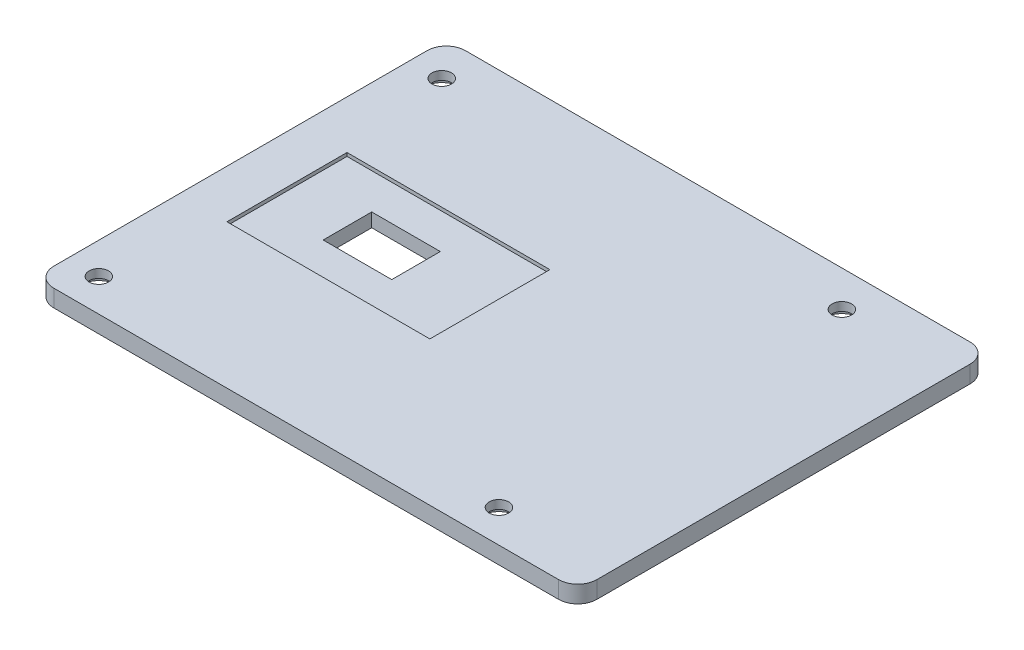
ISO-10303-21;
HEADER;
FILE_DESCRIPTION(('STEP AP214'),'2;1');
FILE_NAME('part.step','',(''),(''),'','','');
FILE_SCHEMA(('AUTOMOTIVE_DESIGN { 1 0 10303 214 1 1 1 1 }'));
ENDSEC;
DATA;
#1=APPLICATION_CONTEXT('core data for automotive mechanical design processes');
#2=APPLICATION_PROTOCOL_DEFINITION('international standard','automotive_design',2000,#1);
#3=PRODUCT_CONTEXT('',#1,'mechanical');
#4=PRODUCT('Part','Part','',(#3));
#5=PRODUCT_RELATED_PRODUCT_CATEGORY('part','',(#4));
#6=PRODUCT_DEFINITION_FORMATION('','',#4);
#7=PRODUCT_DEFINITION_CONTEXT('part definition',#1,'design');
#8=PRODUCT_DEFINITION('design','',#6,#7);
#9=PRODUCT_DEFINITION_SHAPE('','',#8);
#10=(LENGTH_UNIT() NAMED_UNIT(*) SI_UNIT(.MILLI.,.METRE.));
#11=(NAMED_UNIT(*) PLANE_ANGLE_UNIT() SI_UNIT($,.RADIAN.));
#12=(NAMED_UNIT(*) SI_UNIT($,.STERADIAN.) SOLID_ANGLE_UNIT());
#13=UNCERTAINTY_MEASURE_WITH_UNIT(LENGTH_MEASURE(1.E-05),#10,'distance_accuracy_value','');
#14=(GEOMETRIC_REPRESENTATION_CONTEXT(3) GLOBAL_UNCERTAINTY_ASSIGNED_CONTEXT((#13)) GLOBAL_UNIT_ASSIGNED_CONTEXT((#10,
#11,#12)) REPRESENTATION_CONTEXT('',''));
#15=CARTESIAN_POINT('',(0.,0.,0.));
#16=DIRECTION('',(0.,0.,1.));
#17=DIRECTION('',(1.,0.,0.));
#18=AXIS2_PLACEMENT_3D('',#15,#16,#17);
#19=CARTESIAN_POINT('',(-19.5,1.5,36.29));
#20=DIRECTION('',(0.,-1.,0.));
#21=DIRECTION('',(0.,0.,-1.));
#22=AXIS2_PLACEMENT_3D('',#19,#20,#21);
#23=CYLINDRICAL_SURFACE('',#22,3.1);
#24=CARTESIAN_POINT('',(-19.5,1.5,36.29));
#25=DIRECTION('',(0.,-1.,0.));
#26=DIRECTION('',(0.,0.,-1.));
#27=AXIS2_PLACEMENT_3D('',#24,#25,#26);
#28=CIRCLE('',#27,3.1);
#29=CARTESIAN_POINT('',(-19.5,1.5,33.19));
#30=VERTEX_POINT('',#29);
#31=EDGE_CURVE('E185',#30,#30,#28,.T.);
#32=ORIENTED_EDGE('',*,*,#31,.F.);
#33=EDGE_LOOP('',(#32));
#34=FACE_BOUND('',#33,.T.);
#35=CARTESIAN_POINT('',(-19.5,0.5,36.29));
#36=DIRECTION('',(0.,-1.,0.));
#37=DIRECTION('',(0.,0.,-1.));
#38=AXIS2_PLACEMENT_3D('',#35,#36,#37);
#39=CIRCLE('',#38,3.1);
#40=CARTESIAN_POINT('',(-19.5,0.5,33.19));
#41=VERTEX_POINT('',#40);
#42=EDGE_CURVE('E44',#41,#41,#39,.F.);
#43=ORIENTED_EDGE('',*,*,#42,.F.);
#44=EDGE_LOOP('',(#43));
#45=FACE_BOUND('',#44,.T.);
#46=ADVANCED_FACE('F41',(#34,#45),#23,.F.);
#47=CARTESIAN_POINT('',(50.5,1.5,-23.71));
#48=DIRECTION('',(0.,-1.,0.));
#49=DIRECTION('',(0.,0.,-1.));
#50=AXIS2_PLACEMENT_3D('',#47,#48,#49);
#51=CYLINDRICAL_SURFACE('',#50,3.1);
#52=CARTESIAN_POINT('',(50.5,1.5,-23.71));
#53=DIRECTION('',(0.,-1.,0.));
#54=DIRECTION('',(0.,0.,-1.));
#55=AXIS2_PLACEMENT_3D('',#52,#53,#54);
#56=CIRCLE('',#55,3.1);
#57=CARTESIAN_POINT('',(50.5,1.5,-26.81));
#58=VERTEX_POINT('',#57);
#59=EDGE_CURVE('E320',#58,#58,#56,.T.);
#60=ORIENTED_EDGE('',*,*,#59,.F.);
#61=EDGE_LOOP('',(#60));
#62=FACE_BOUND('',#61,.T.);
#63=CARTESIAN_POINT('',(50.5,0.5,-23.71));
#64=DIRECTION('',(0.,-1.,0.));
#65=DIRECTION('',(0.,0.,-1.));
#66=AXIS2_PLACEMENT_3D('',#63,#64,#65);
#67=CIRCLE('',#66,3.1);
#68=CARTESIAN_POINT('',(50.5,0.5,-26.81));
#69=VERTEX_POINT('',#68);
#70=EDGE_CURVE('E315',#69,#69,#67,.F.);
#71=ORIENTED_EDGE('',*,*,#70,.F.);
#72=EDGE_LOOP('',(#71));
#73=FACE_BOUND('',#72,.T.);
#74=ADVANCED_FACE('F341',(#62,#73),#51,.F.);
#75=CARTESIAN_POINT('',(50.5,1.5,36.29));
#76=DIRECTION('',(0.,-1.,0.));
#77=DIRECTION('',(0.,0.,-1.));
#78=AXIS2_PLACEMENT_3D('',#75,#76,#77);
#79=CYLINDRICAL_SURFACE('',#78,3.1);
#80=CARTESIAN_POINT('',(50.5,1.5,36.29));
#81=DIRECTION('',(0.,-1.,0.));
#82=DIRECTION('',(0.,0.,-1.));
#83=AXIS2_PLACEMENT_3D('',#80,#81,#82);
#84=CIRCLE('',#83,3.1);
#85=CARTESIAN_POINT('',(50.5,1.5,33.19));
#86=VERTEX_POINT('',#85);
#87=EDGE_CURVE('E324',#86,#86,#84,.T.);
#88=ORIENTED_EDGE('',*,*,#87,.F.);
#89=EDGE_LOOP('',(#88));
#90=FACE_BOUND('',#89,.T.);
#91=CARTESIAN_POINT('',(50.5,0.5,36.29));
#92=DIRECTION('',(0.,-1.,0.));
#93=DIRECTION('',(0.,0.,-1.));
#94=AXIS2_PLACEMENT_3D('',#91,#92,#93);
#95=CIRCLE('',#94,3.1);
#96=CARTESIAN_POINT('',(50.5,0.5,33.19));
#97=VERTEX_POINT('',#96);
#98=EDGE_CURVE('E307',#97,#97,#95,.F.);
#99=ORIENTED_EDGE('',*,*,#98,.F.);
#100=EDGE_LOOP('',(#99));
#101=FACE_BOUND('',#100,.T.);
#102=ADVANCED_FACE('F346',(#90,#101),#79,.F.);
#103=CARTESIAN_POINT('',(-19.5,1.5,-23.71));
#104=DIRECTION('',(0.,-1.,0.));
#105=DIRECTION('',(0.,0.,-1.));
#106=AXIS2_PLACEMENT_3D('',#103,#104,#105);
#107=CYLINDRICAL_SURFACE('',#106,3.1);
#108=CARTESIAN_POINT('',(-19.5,1.5,-23.71));
#109=DIRECTION('',(0.,-1.,0.));
#110=DIRECTION('',(0.,0.,-1.));
#111=AXIS2_PLACEMENT_3D('',#108,#109,#110);
#112=CIRCLE('',#111,3.1);
#113=CARTESIAN_POINT('',(-19.5,1.5,-26.81));
#114=VERTEX_POINT('',#113);
#115=EDGE_CURVE('E328',#114,#114,#112,.T.);
#116=ORIENTED_EDGE('',*,*,#115,.F.);
#117=EDGE_LOOP('',(#116));
#118=FACE_BOUND('',#117,.T.);
#119=CARTESIAN_POINT('',(-19.5,0.5,-23.71));
#120=DIRECTION('',(0.,-1.,0.));
#121=DIRECTION('',(0.,0.,-1.));
#122=AXIS2_PLACEMENT_3D('',#119,#120,#121);
#123=CIRCLE('',#122,3.1);
#124=CARTESIAN_POINT('',(-19.5,0.5,-26.81));
#125=VERTEX_POINT('',#124);
#126=EDGE_CURVE('E306',#125,#125,#123,.F.);
#127=ORIENTED_EDGE('',*,*,#126,.F.);
#128=EDGE_LOOP('',(#127));
#129=FACE_BOUND('',#128,.T.);
#130=ADVANCED_FACE('F398',(#118,#129),#107,.F.);
#131=CARTESIAN_POINT('',(-19.5,0.,-23.71));
#132=DIRECTION('',(0.,1.,0.));
#133=DIRECTION('',(0.,0.,1.));
#134=AXIS2_PLACEMENT_3D('',#131,#132,#133);
#135=CYLINDRICAL_SURFACE('',#134,1.7);
#136=CARTESIAN_POINT('',(-19.5,3.,-23.71));
#137=DIRECTION('',(0.,1.,0.));
#138=DIRECTION('',(0.,0.,1.));
#139=AXIS2_PLACEMENT_3D('',#136,#137,#138);
#140=CIRCLE('',#139,1.7);
#141=CARTESIAN_POINT('',(-19.5,3.,-22.01));
#142=VERTEX_POINT('',#141);
#143=EDGE_CURVE('E236',#142,#142,#140,.T.);
#144=ORIENTED_EDGE('',*,*,#143,.T.);
#145=EDGE_LOOP('',(#144));
#146=FACE_BOUND('',#145,.T.);
#147=CARTESIAN_POINT('',(-19.5,1.5,-23.71));
#148=DIRECTION('',(0.,-1.,0.));
#149=DIRECTION('',(0.,0.,-1.));
#150=AXIS2_PLACEMENT_3D('',#147,#148,#149);
#151=CIRCLE('',#150,1.7);
#152=CARTESIAN_POINT('',(-19.5,1.5,-25.41));
#153=VERTEX_POINT('',#152);
#154=EDGE_CURVE('E186',#153,#153,#151,.F.);
#155=ORIENTED_EDGE('',*,*,#154,.F.);
#156=EDGE_LOOP('',(#155));
#157=FACE_BOUND('',#156,.T.);
#158=ADVANCED_FACE('F387',(#146,#157),#135,.F.);
#159=CARTESIAN_POINT('',(50.5,0.,36.29));
#160=DIRECTION('',(0.,1.,0.));
#161=DIRECTION('',(0.,0.,1.));
#162=AXIS2_PLACEMENT_3D('',#159,#160,#161);
#163=CYLINDRICAL_SURFACE('',#162,1.7);
#164=CARTESIAN_POINT('',(50.5,3.,36.29));
#165=DIRECTION('',(0.,1.,0.));
#166=DIRECTION('',(0.,0.,1.));
#167=AXIS2_PLACEMENT_3D('',#164,#165,#166);
#168=CIRCLE('',#167,1.7);
#169=CARTESIAN_POINT('',(50.5,3.,37.99));
#170=VERTEX_POINT('',#169);
#171=EDGE_CURVE('E224',#170,#170,#168,.T.);
#172=ORIENTED_EDGE('',*,*,#171,.T.);
#173=EDGE_LOOP('',(#172));
#174=FACE_BOUND('',#173,.T.);
#175=CARTESIAN_POINT('',(50.5,1.5,36.29));
#176=DIRECTION('',(0.,-1.,0.));
#177=DIRECTION('',(0.,0.,-1.));
#178=AXIS2_PLACEMENT_3D('',#175,#176,#177);
#179=CIRCLE('',#178,1.7);
#180=CARTESIAN_POINT('',(50.5,1.5,34.59));
#181=VERTEX_POINT('',#180);
#182=EDGE_CURVE('E301',#181,#181,#179,.F.);
#183=ORIENTED_EDGE('',*,*,#182,.F.);
#184=EDGE_LOOP('',(#183));
#185=FACE_BOUND('',#184,.T.);
#186=ADVANCED_FACE('F389',(#174,#185),#163,.F.);
#187=CARTESIAN_POINT('',(50.5,0.,-23.71));
#188=DIRECTION('',(0.,1.,0.));
#189=DIRECTION('',(0.,0.,1.));
#190=AXIS2_PLACEMENT_3D('',#187,#188,#189);
#191=CYLINDRICAL_SURFACE('',#190,1.7);
#192=CARTESIAN_POINT('',(50.5,3.,-23.71));
#193=DIRECTION('',(0.,1.,0.));
#194=DIRECTION('',(0.,0.,1.));
#195=AXIS2_PLACEMENT_3D('',#192,#193,#194);
#196=CIRCLE('',#195,1.7);
#197=CARTESIAN_POINT('',(50.5,3.,-22.01));
#198=VERTEX_POINT('',#197);
#199=EDGE_CURVE('E235',#198,#198,#196,.T.);
#200=ORIENTED_EDGE('',*,*,#199,.T.);
#201=EDGE_LOOP('',(#200));
#202=FACE_BOUND('',#201,.T.);
#203=CARTESIAN_POINT('',(50.5,1.5,-23.71));
#204=DIRECTION('',(0.,-1.,0.));
#205=DIRECTION('',(0.,0.,-1.));
#206=AXIS2_PLACEMENT_3D('',#203,#204,#205);
#207=CIRCLE('',#206,1.7);
#208=CARTESIAN_POINT('',(50.5,1.5,-25.41));
#209=VERTEX_POINT('',#208);
#210=EDGE_CURVE('E296',#209,#209,#207,.F.);
#211=ORIENTED_EDGE('',*,*,#210,.F.);
#212=EDGE_LOOP('',(#211));
#213=FACE_BOUND('',#212,.T.);
#214=ADVANCED_FACE('F388',(#202,#213),#191,.F.);
#215=CARTESIAN_POINT('',(-19.5,0.,36.29));
#216=DIRECTION('',(0.,1.,0.));
#217=DIRECTION('',(0.,0.,1.));
#218=AXIS2_PLACEMENT_3D('',#215,#216,#217);
#219=CYLINDRICAL_SURFACE('',#218,1.7);
#220=CARTESIAN_POINT('',(-19.5,3.,36.29));
#221=DIRECTION('',(0.,1.,0.));
#222=DIRECTION('',(0.,0.,1.));
#223=AXIS2_PLACEMENT_3D('',#220,#221,#222);
#224=CIRCLE('',#223,1.7);
#225=CARTESIAN_POINT('',(-19.5,3.,37.99));
#226=VERTEX_POINT('',#225);
#227=EDGE_CURVE('E231',#226,#226,#224,.T.);
#228=ORIENTED_EDGE('',*,*,#227,.T.);
#229=EDGE_LOOP('',(#228));
#230=FACE_BOUND('',#229,.T.);
#231=CARTESIAN_POINT('',(-19.5,1.5,36.29));
#232=DIRECTION('',(0.,-1.,0.));
#233=DIRECTION('',(0.,0.,-1.));
#234=AXIS2_PLACEMENT_3D('',#231,#232,#233);
#235=CIRCLE('',#234,1.7);
#236=CARTESIAN_POINT('',(-19.5,1.5,34.59));
#237=VERTEX_POINT('',#236);
#238=EDGE_CURVE('E294',#237,#237,#235,.F.);
#239=ORIENTED_EDGE('',*,*,#238,.F.);
#240=EDGE_LOOP('',(#239));
#241=FACE_BOUND('',#240,.T.);
#242=ADVANCED_FACE('F367',(#230,#241),#219,.F.);
#243=CARTESIAN_POINT('',(0.,2.4,0.));
#244=DIRECTION('',(0.,-1.,0.));
#245=DIRECTION('',(0.,0.,-1.));
#246=AXIS2_PLACEMENT_3D('',#243,#244,#245);
#247=PLANE('',#246);
#248=DIRECTION('',(1.,0.,0.));
#249=VECTOR('',#248,1.);
#250=CARTESIAN_POINT('',(-16.574,2.4,16.795));
#251=LINE('',#250,#249);
#252=CARTESIAN_POINT('',(-16.574,2.4,16.795));
#253=VERTEX_POINT('',#252);
#254=CARTESIAN_POINT('',(18.926,2.4,16.795));
#255=VERTEX_POINT('',#254);
#256=EDGE_CURVE('E196',#253,#255,#251,.T.);
#257=ORIENTED_EDGE('',*,*,#256,.T.);
#258=DIRECTION('',(0.,0.,-1.));
#259=VECTOR('',#258,1.);
#260=CARTESIAN_POINT('',(18.926,2.4,-4.20500000000001));
#261=LINE('',#260,#259);
#262=CARTESIAN_POINT('',(18.926,2.4,-4.20500000000001));
#263=VERTEX_POINT('',#262);
#264=EDGE_CURVE('E202',#255,#263,#261,.T.);
#265=ORIENTED_EDGE('',*,*,#264,.T.);
#266=DIRECTION('',(-1.,0.,0.));
#267=VECTOR('',#266,1.);
#268=CARTESIAN_POINT('',(-16.574,2.4,-4.205));
#269=LINE('',#268,#267);
#270=CARTESIAN_POINT('',(-16.574,2.4,-4.205));
#271=VERTEX_POINT('',#270);
#272=EDGE_CURVE('E203',#263,#271,#269,.T.);
#273=ORIENTED_EDGE('',*,*,#272,.T.);
#274=DIRECTION('',(0.,0.,1.));
#275=VECTOR('',#274,1.);
#276=CARTESIAN_POINT('',(-16.574,2.4,-4.205));
#277=LINE('',#276,#275);
#278=EDGE_CURVE('E206',#271,#253,#277,.T.);
#279=ORIENTED_EDGE('',*,*,#278,.T.);
#280=EDGE_LOOP('',(#257,#265,#273,#279));
#281=FACE_BOUND('',#280,.T.);
#282=DIRECTION('',(0.,0.,-1.));
#283=VECTOR('',#282,1.);
#284=CARTESIAN_POINT('',(6.,2.4,2.04));
#285=LINE('',#284,#283);
#286=CARTESIAN_POINT('',(6.,2.4,10.54));
#287=VERTEX_POINT('',#286);
#288=CARTESIAN_POINT('',(6.,2.4,2.04));
#289=VERTEX_POINT('',#288);
#290=EDGE_CURVE('E162',#287,#289,#285,.T.);
#291=ORIENTED_EDGE('',*,*,#290,.F.);
#292=DIRECTION('',(1.,0.,0.));
#293=VECTOR('',#292,1.);
#294=CARTESIAN_POINT('',(-6.,2.4,10.54));
#295=LINE('',#294,#293);
#296=CARTESIAN_POINT('',(-6.,2.4,10.54));
#297=VERTEX_POINT('',#296);
#298=EDGE_CURVE('E180',#297,#287,#295,.T.);
#299=ORIENTED_EDGE('',*,*,#298,.F.);
#300=DIRECTION('',(0.,0.,1.));
#301=VECTOR('',#300,1.);
#302=CARTESIAN_POINT('',(-6.,2.4,2.04));
#303=LINE('',#302,#301);
#304=CARTESIAN_POINT('',(-6.,2.4,2.04));
#305=VERTEX_POINT('',#304);
#306=EDGE_CURVE('E59',#305,#297,#303,.T.);
#307=ORIENTED_EDGE('',*,*,#306,.F.);
#308=DIRECTION('',(-1.,0.,0.));
#309=VECTOR('',#308,1.);
#310=CARTESIAN_POINT('',(-6.,2.4,2.04));
#311=LINE('',#310,#309);
#312=EDGE_CURVE('E189',#289,#305,#311,.T.);
#313=ORIENTED_EDGE('',*,*,#312,.F.);
#314=EDGE_LOOP('',(#291,#299,#307,#313));
#315=FACE_BOUND('',#314,.T.);
#316=ADVANCED_FACE('F366',(#281,#315),#247,.F.);
#317=CARTESIAN_POINT('',(-21.65,3.,-26.65));
#318=DIRECTION('',(0.,-1.,0.));
#319=DIRECTION('',(0.,0.,-1.));
#320=AXIS2_PLACEMENT_3D('',#317,#318,#319);
#321=CYLINDRICAL_SURFACE('',#320,3.35);
#322=CARTESIAN_POINT('',(-21.65,0.,-26.65));
#323=DIRECTION('',(0.,1.,0.));
#324=DIRECTION('',(0.,0.,1.));
#325=AXIS2_PLACEMENT_3D('',#322,#323,#324);
#326=CIRCLE('',#325,3.35);
#327=CARTESIAN_POINT('',(-21.65,0.,-30.));
#328=VERTEX_POINT('',#327);
#329=CARTESIAN_POINT('',(-25.,0.,-26.65));
#330=VERTEX_POINT('',#329);
#331=EDGE_CURVE('E241',#328,#330,#326,.T.);
#332=ORIENTED_EDGE('',*,*,#331,.T.);
#333=DIRECTION('',(0.,-1.,0.));
#334=VECTOR('',#333,1.);
#335=CARTESIAN_POINT('',(-25.,3.,-26.65));
#336=LINE('',#335,#334);
#337=CARTESIAN_POINT('',(-25.,3.,-26.65));
#338=VERTEX_POINT('',#337);
#339=EDGE_CURVE('E11',#338,#330,#336,.T.);
#340=ORIENTED_EDGE('',*,*,#339,.F.);
#341=CARTESIAN_POINT('',(-21.65,3.,-26.65));
#342=DIRECTION('',(0.,1.,0.));
#343=DIRECTION('',(0.,0.,1.));
#344=AXIS2_PLACEMENT_3D('',#341,#342,#343);
#345=CIRCLE('',#344,3.35);
#346=CARTESIAN_POINT('',(-21.65,3.,-30.));
#347=VERTEX_POINT('',#346);
#348=EDGE_CURVE('E245',#347,#338,#345,.T.);
#349=ORIENTED_EDGE('',*,*,#348,.F.);
#350=DIRECTION('',(0.,-1.,0.));
#351=VECTOR('',#350,1.);
#352=CARTESIAN_POINT('',(-21.65,3.,-30.));
#353=LINE('',#352,#351);
#354=EDGE_CURVE('E257',#347,#328,#353,.T.);
#355=ORIENTED_EDGE('',*,*,#354,.T.);
#356=EDGE_LOOP('',(#332,#340,#349,#355));
#357=FACE_BOUND('',#356,.T.);
#358=ADVANCED_FACE('F43',(#357),#321,.T.);
#359=CARTESIAN_POINT('',(-25.,3.,-26.65));
#360=DIRECTION('',(1.,0.,0.));
#361=DIRECTION('',(0.,0.,-1.));
#362=AXIS2_PLACEMENT_3D('',#359,#360,#361);
#363=PLANE('',#362);
#364=DIRECTION('',(0.,0.,1.));
#365=VECTOR('',#364,1.);
#366=CARTESIAN_POINT('',(-25.,0.,-26.65));
#367=LINE('',#366,#365);
#368=CARTESIAN_POINT('',(-25.,0.,38.65));
#369=VERTEX_POINT('',#368);
#370=EDGE_CURVE('E261',#330,#369,#367,.T.);
#371=ORIENTED_EDGE('',*,*,#370,.T.);
#372=DIRECTION('',(0.,-1.,0.));
#373=VECTOR('',#372,1.);
#374=CARTESIAN_POINT('',(-25.,3.,38.65));
#375=LINE('',#374,#373);
#376=CARTESIAN_POINT('',(-25.,3.,38.65));
#377=VERTEX_POINT('',#376);
#378=EDGE_CURVE('E49',#377,#369,#375,.T.);
#379=ORIENTED_EDGE('',*,*,#378,.F.);
#380=DIRECTION('',(0.,0.,1.));
#381=VECTOR('',#380,1.);
#382=CARTESIAN_POINT('',(-25.,3.,-26.65));
#383=LINE('',#382,#381);
#384=EDGE_CURVE('E244',#338,#377,#383,.T.);
#385=ORIENTED_EDGE('',*,*,#384,.F.);
#386=ORIENTED_EDGE('',*,*,#339,.T.);
#387=EDGE_LOOP('',(#371,#379,#385,#386));
#388=FACE_BOUND('',#387,.T.);
#389=ADVANCED_FACE('F431',(#388),#363,.F.);
#390=CARTESIAN_POINT('',(-21.65,3.,38.65));
#391=DIRECTION('',(0.,-1.,0.));
#392=DIRECTION('',(0.,0.,-1.));
#393=AXIS2_PLACEMENT_3D('',#390,#391,#392);
#394=CYLINDRICAL_SURFACE('',#393,3.35);
#395=CARTESIAN_POINT('',(-21.65,0.,38.65));
#396=DIRECTION('',(0.,1.,0.));
#397=DIRECTION('',(0.,0.,1.));
#398=AXIS2_PLACEMENT_3D('',#395,#396,#397);
#399=CIRCLE('',#398,3.35);
#400=CARTESIAN_POINT('',(-21.65,0.,42.));
#401=VERTEX_POINT('',#400);
#402=EDGE_CURVE('E262',#369,#401,#399,.T.);
#403=ORIENTED_EDGE('',*,*,#402,.T.);
#404=DIRECTION('',(0.,-1.,0.));
#405=VECTOR('',#404,1.);
#406=CARTESIAN_POINT('',(-21.65,3.,42.));
#407=LINE('',#406,#405);
#408=CARTESIAN_POINT('',(-21.65,3.,42.));
#409=VERTEX_POINT('',#408);
#410=EDGE_CURVE('E288',#409,#401,#407,.T.);
#411=ORIENTED_EDGE('',*,*,#410,.F.);
#412=CARTESIAN_POINT('',(-21.65,3.,38.65));
#413=DIRECTION('',(0.,1.,0.));
#414=DIRECTION('',(0.,0.,1.));
#415=AXIS2_PLACEMENT_3D('',#412,#413,#414);
#416=CIRCLE('',#415,3.35);
#417=EDGE_CURVE('E247',#377,#409,#416,.T.);
#418=ORIENTED_EDGE('',*,*,#417,.F.);
#419=ORIENTED_EDGE('',*,*,#378,.T.);
#420=EDGE_LOOP('',(#403,#411,#418,#419));
#421=FACE_BOUND('',#420,.T.);
#422=ADVANCED_FACE('F426',(#421),#394,.T.);
#423=CARTESIAN_POINT('',(-21.65,3.,42.));
#424=DIRECTION('',(0.,0.,-1.));
#425=DIRECTION('',(-1.,0.,0.));
#426=AXIS2_PLACEMENT_3D('',#423,#424,#425);
#427=PLANE('',#426);
#428=DIRECTION('',(1.,0.,0.));
#429=VECTOR('',#428,1.);
#430=CARTESIAN_POINT('',(-21.65,0.,42.));
#431=LINE('',#430,#429);
#432=CARTESIAN_POINT('',(66.65,0.,42.));
#433=VERTEX_POINT('',#432);
#434=EDGE_CURVE('E270',#401,#433,#431,.T.);
#435=ORIENTED_EDGE('',*,*,#434,.T.);
#436=DIRECTION('',(0.,-1.,0.));
#437=VECTOR('',#436,1.);
#438=CARTESIAN_POINT('',(66.65,3.,42.));
#439=LINE('',#438,#437);
#440=CARTESIAN_POINT('',(66.65,3.,42.));
#441=VERTEX_POINT('',#440);
#442=EDGE_CURVE('E290',#441,#433,#439,.T.);
#443=ORIENTED_EDGE('',*,*,#442,.F.);
#444=DIRECTION('',(1.,0.,0.));
#445=VECTOR('',#444,1.);
#446=CARTESIAN_POINT('',(-21.65,3.,42.));
#447=LINE('',#446,#445);
#448=EDGE_CURVE('E249',#409,#441,#447,.T.);
#449=ORIENTED_EDGE('',*,*,#448,.F.);
#450=ORIENTED_EDGE('',*,*,#410,.T.);
#451=EDGE_LOOP('',(#435,#443,#449,#450));
#452=FACE_BOUND('',#451,.T.);
#453=ADVANCED_FACE('F425',(#452),#427,.F.);
#454=CARTESIAN_POINT('',(66.65,3.,38.65));
#455=DIRECTION('',(0.,-1.,0.));
#456=DIRECTION('',(0.,0.,-1.));
#457=AXIS2_PLACEMENT_3D('',#454,#455,#456);
#458=CYLINDRICAL_SURFACE('',#457,3.35);
#459=CARTESIAN_POINT('',(66.65,0.,38.65));
#460=DIRECTION('',(0.,1.,0.));
#461=DIRECTION('',(0.,0.,1.));
#462=AXIS2_PLACEMENT_3D('',#459,#460,#461);
#463=CIRCLE('',#462,3.35);
#464=CARTESIAN_POINT('',(70.,0.,38.65));
#465=VERTEX_POINT('',#464);
#466=EDGE_CURVE('E266',#433,#465,#463,.T.);
#467=ORIENTED_EDGE('',*,*,#466,.T.);
#468=DIRECTION('',(0.,-1.,0.));
#469=VECTOR('',#468,1.);
#470=CARTESIAN_POINT('',(70.,3.,38.65));
#471=LINE('',#470,#469);
#472=CARTESIAN_POINT('',(70.,3.,38.65));
#473=VERTEX_POINT('',#472);
#474=EDGE_CURVE('E284',#473,#465,#471,.T.);
#475=ORIENTED_EDGE('',*,*,#474,.F.);
#476=CARTESIAN_POINT('',(66.65,3.,38.65));
#477=DIRECTION('',(0.,1.,0.));
#478=DIRECTION('',(0.,0.,1.));
#479=AXIS2_PLACEMENT_3D('',#476,#477,#478);
#480=CIRCLE('',#479,3.35);
#481=EDGE_CURVE('E255',#441,#473,#480,.T.);
#482=ORIENTED_EDGE('',*,*,#481,.F.);
#483=ORIENTED_EDGE('',*,*,#442,.T.);
#484=EDGE_LOOP('',(#467,#475,#482,#483));
#485=FACE_BOUND('',#484,.T.);
#486=ADVANCED_FACE('F418',(#485),#458,.T.);
#487=CARTESIAN_POINT('',(70.,3.,-26.65));
#488=DIRECTION('',(-1.,0.,0.));
#489=DIRECTION('',(0.,0.,1.));
#490=AXIS2_PLACEMENT_3D('',#487,#488,#489);
#491=PLANE('',#490);
#492=DIRECTION('',(0.,0.,-1.));
#493=VECTOR('',#492,1.);
#494=CARTESIAN_POINT('',(70.,0.,-26.65));
#495=LINE('',#494,#493);
#496=CARTESIAN_POINT('',(70.,0.,-26.65));
#497=VERTEX_POINT('',#496);
#498=EDGE_CURVE('E272',#465,#497,#495,.T.);
#499=ORIENTED_EDGE('',*,*,#498,.T.);
#500=DIRECTION('',(0.,-1.,0.));
#501=VECTOR('',#500,1.);
#502=CARTESIAN_POINT('',(70.,3.,-26.65));
#503=LINE('',#502,#501);
#504=CARTESIAN_POINT('',(70.,3.,-26.65));
#505=VERTEX_POINT('',#504);
#506=EDGE_CURVE('E283',#505,#497,#503,.T.);
#507=ORIENTED_EDGE('',*,*,#506,.F.);
#508=DIRECTION('',(0.,0.,-1.));
#509=VECTOR('',#508,1.);
#510=CARTESIAN_POINT('',(70.,3.,-26.65));
#511=LINE('',#510,#509);
#512=EDGE_CURVE('E251',#473,#505,#511,.T.);
#513=ORIENTED_EDGE('',*,*,#512,.F.);
#514=ORIENTED_EDGE('',*,*,#474,.T.);
#515=EDGE_LOOP('',(#499,#507,#513,#514));
#516=FACE_BOUND('',#515,.T.);
#517=ADVANCED_FACE('F417',(#516),#491,.F.);
#518=CARTESIAN_POINT('',(66.65,3.,-26.65));
#519=DIRECTION('',(0.,-1.,0.));
#520=DIRECTION('',(0.,0.,-1.));
#521=AXIS2_PLACEMENT_3D('',#518,#519,#520);
#522=CYLINDRICAL_SURFACE('',#521,3.35);
#523=CARTESIAN_POINT('',(66.65,0.,-26.65));
#524=DIRECTION('',(0.,1.,0.));
#525=DIRECTION('',(0.,0.,-1.));
#526=AXIS2_PLACEMENT_3D('',#523,#524,#525);
#527=CIRCLE('',#526,3.35);
#528=CARTESIAN_POINT('',(66.65,0.,-30.));
#529=VERTEX_POINT('',#528);
#530=EDGE_CURVE('E271',#497,#529,#527,.T.);
#531=ORIENTED_EDGE('',*,*,#530,.T.);
#532=DIRECTION('',(0.,-1.,0.));
#533=VECTOR('',#532,1.);
#534=CARTESIAN_POINT('',(66.65,3.,-30.));
#535=LINE('',#534,#533);
#536=CARTESIAN_POINT('',(66.65,3.,-30.));
#537=VERTEX_POINT('',#536);
#538=EDGE_CURVE('E280',#537,#529,#535,.T.);
#539=ORIENTED_EDGE('',*,*,#538,.F.);
#540=CARTESIAN_POINT('',(66.65,3.,-26.65));
#541=DIRECTION('',(0.,1.,0.));
#542=DIRECTION('',(0.,0.,-1.));
#543=AXIS2_PLACEMENT_3D('',#540,#541,#542);
#544=CIRCLE('',#543,3.35);
#545=EDGE_CURVE('E259',#505,#537,#544,.T.);
#546=ORIENTED_EDGE('',*,*,#545,.F.);
#547=ORIENTED_EDGE('',*,*,#506,.T.);
#548=EDGE_LOOP('',(#531,#539,#546,#547));
#549=FACE_BOUND('',#548,.T.);
#550=ADVANCED_FACE('F415',(#549),#522,.T.);
#551=CARTESIAN_POINT('',(-21.65,3.,-30.));
#552=DIRECTION('',(0.,0.,1.));
#553=DIRECTION('',(1.,0.,0.));
#554=AXIS2_PLACEMENT_3D('',#551,#552,#553);
#555=PLANE('',#554);
#556=DIRECTION('',(-1.,0.,0.));
#557=VECTOR('',#556,1.);
#558=CARTESIAN_POINT('',(-21.65,0.,-30.));
#559=LINE('',#558,#557);
#560=EDGE_CURVE('E246',#529,#328,#559,.T.);
#561=ORIENTED_EDGE('',*,*,#560,.T.);
#562=ORIENTED_EDGE('',*,*,#354,.F.);
#563=DIRECTION('',(-1.,0.,0.));
#564=VECTOR('',#563,1.);
#565=CARTESIAN_POINT('',(-21.65,3.,-30.));
#566=LINE('',#565,#564);
#567=EDGE_CURVE('E260',#537,#347,#566,.T.);
#568=ORIENTED_EDGE('',*,*,#567,.F.);
#569=ORIENTED_EDGE('',*,*,#538,.T.);
#570=EDGE_LOOP('',(#561,#562,#568,#569));
#571=FACE_BOUND('',#570,.T.);
#572=ADVANCED_FACE('F403',(#571),#555,.F.);
#573=CARTESIAN_POINT('',(-21.65,3.,-26.65));
#574=DIRECTION('',(0.,1.,0.));
#575=DIRECTION('',(0.,0.,1.));
#576=AXIS2_PLACEMENT_3D('',#573,#574,#575);
#577=PLANE('',#576);
#578=DIRECTION('',(1.,0.,0.));
#579=VECTOR('',#578,1.);
#580=CARTESIAN_POINT('',(-16.574,3.,16.795));
#581=LINE('',#580,#579);
#582=CARTESIAN_POINT('',(-16.574,3.,16.795));
#583=VERTEX_POINT('',#582);
#584=CARTESIAN_POINT('',(18.926,3.,16.795));
#585=VERTEX_POINT('',#584);
#586=EDGE_CURVE('E193',#583,#585,#581,.T.);
#587=ORIENTED_EDGE('',*,*,#586,.F.);
#588=DIRECTION('',(0.,0.,1.));
#589=VECTOR('',#588,1.);
#590=CARTESIAN_POINT('',(-16.574,3.,-4.205));
#591=LINE('',#590,#589);
#592=CARTESIAN_POINT('',(-16.574,3.,-4.205));
#593=VERTEX_POINT('',#592);
#594=EDGE_CURVE('E205',#593,#583,#591,.T.);
#595=ORIENTED_EDGE('',*,*,#594,.F.);
#596=DIRECTION('',(-1.,0.,0.));
#597=VECTOR('',#596,1.);
#598=CARTESIAN_POINT('',(-16.574,3.,-4.205));
#599=LINE('',#598,#597);
#600=CARTESIAN_POINT('',(18.926,3.,-4.20500000000001));
#601=VERTEX_POINT('',#600);
#602=EDGE_CURVE('E218',#601,#593,#599,.T.);
#603=ORIENTED_EDGE('',*,*,#602,.F.);
#604=DIRECTION('',(0.,0.,-1.));
#605=VECTOR('',#604,1.);
#606=CARTESIAN_POINT('',(18.926,3.,-4.20500000000001));
#607=LINE('',#606,#605);
#608=EDGE_CURVE('E215',#585,#601,#607,.T.);
#609=ORIENTED_EDGE('',*,*,#608,.F.);
#610=EDGE_LOOP('',(#587,#595,#603,#609));
#611=FACE_BOUND('',#610,.T.);
#612=ORIENTED_EDGE('',*,*,#227,.F.);
#613=EDGE_LOOP('',(#612));
#614=FACE_BOUND('',#613,.T.);
#615=ORIENTED_EDGE('',*,*,#199,.F.);
#616=EDGE_LOOP('',(#615));
#617=FACE_BOUND('',#616,.T.);
#618=ORIENTED_EDGE('',*,*,#171,.F.);
#619=EDGE_LOOP('',(#618));
#620=FACE_BOUND('',#619,.T.);
#621=ORIENTED_EDGE('',*,*,#143,.F.);
#622=EDGE_LOOP('',(#621));
#623=FACE_BOUND('',#622,.T.);
#624=ORIENTED_EDGE('',*,*,#348,.T.);
#625=ORIENTED_EDGE('',*,*,#384,.T.);
#626=ORIENTED_EDGE('',*,*,#417,.T.);
#627=ORIENTED_EDGE('',*,*,#448,.T.);
#628=ORIENTED_EDGE('',*,*,#481,.T.);
#629=ORIENTED_EDGE('',*,*,#512,.T.);
#630=ORIENTED_EDGE('',*,*,#545,.T.);
#631=ORIENTED_EDGE('',*,*,#567,.T.);
#632=EDGE_LOOP('',(#624,#625,#626,#627,#628,#629,#630,#631));
#633=FACE_BOUND('',#632,.T.);
#634=ADVANCED_FACE('F405',(#611,#614,#617,#620,#623,#633),#577,.T.);
#635=CARTESIAN_POINT('',(-21.65,0.,-26.65));
#636=DIRECTION('',(0.,1.,0.));
#637=DIRECTION('',(0.,0.,1.));
#638=AXIS2_PLACEMENT_3D('',#635,#636,#637);
#639=PLANE('',#638);
#640=CARTESIAN_POINT('',(-19.5,0.,-23.71));
#641=DIRECTION('',(0.,-1.,0.));
#642=DIRECTION('',(0.,0.,-1.));
#643=AXIS2_PLACEMENT_3D('',#640,#641,#642);
#644=CIRCLE('',#643,3.35);
#645=CARTESIAN_POINT('',(-19.5,0.,-27.06));
#646=VERTEX_POINT('',#645);
#647=EDGE_CURVE('E740',#646,#646,#644,.T.);
#648=ORIENTED_EDGE('',*,*,#647,.F.);
#649=EDGE_LOOP('',(#648));
#650=FACE_BOUND('',#649,.T.);
#651=CARTESIAN_POINT('',(50.5,0.,36.29));
#652=DIRECTION('',(0.,-1.,0.));
#653=DIRECTION('',(0.,0.,-1.));
#654=AXIS2_PLACEMENT_3D('',#651,#652,#653);
#655=CIRCLE('',#654,3.35);
#656=CARTESIAN_POINT('',(50.5,0.,32.94));
#657=VERTEX_POINT('',#656);
#658=EDGE_CURVE('E741',#657,#657,#655,.T.);
#659=ORIENTED_EDGE('',*,*,#658,.F.);
#660=EDGE_LOOP('',(#659));
#661=FACE_BOUND('',#660,.T.);
#662=CARTESIAN_POINT('',(50.5,0.,-23.71));
#663=DIRECTION('',(0.,-1.,0.));
#664=DIRECTION('',(0.,0.,-1.));
#665=AXIS2_PLACEMENT_3D('',#662,#663,#664);
#666=CIRCLE('',#665,3.35);
#667=CARTESIAN_POINT('',(50.5,0.,-27.06));
#668=VERTEX_POINT('',#667);
#669=EDGE_CURVE('E754',#668,#668,#666,.T.);
#670=ORIENTED_EDGE('',*,*,#669,.F.);
#671=EDGE_LOOP('',(#670));
#672=FACE_BOUND('',#671,.T.);
#673=CARTESIAN_POINT('',(-19.5,0.,36.29));
#674=DIRECTION('',(0.,-1.,0.));
#675=DIRECTION('',(0.,0.,-1.));
#676=AXIS2_PLACEMENT_3D('',#673,#674,#675);
#677=CIRCLE('',#676,3.35);
#678=CARTESIAN_POINT('',(-19.5,0.,32.94));
#679=VERTEX_POINT('',#678);
#680=EDGE_CURVE('E329',#679,#679,#677,.T.);
#681=ORIENTED_EDGE('',*,*,#680,.F.);
#682=EDGE_LOOP('',(#681));
#683=FACE_BOUND('',#682,.T.);
#684=DIRECTION('',(1.,0.,0.));
#685=VECTOR('',#684,1.);
#686=CARTESIAN_POINT('',(-6.,0.,10.54));
#687=LINE('',#686,#685);
#688=CARTESIAN_POINT('',(-6.,0.,10.54));
#689=VERTEX_POINT('',#688);
#690=CARTESIAN_POINT('',(6.,0.,10.54));
#691=VERTEX_POINT('',#690);
#692=EDGE_CURVE('E170',#689,#691,#687,.T.);
#693=ORIENTED_EDGE('',*,*,#692,.T.);
#694=DIRECTION('',(0.,0.,-1.));
#695=VECTOR('',#694,1.);
#696=CARTESIAN_POINT('',(6.,0.,2.04));
#697=LINE('',#696,#695);
#698=CARTESIAN_POINT('',(6.,0.,2.04));
#699=VERTEX_POINT('',#698);
#700=EDGE_CURVE('E156',#691,#699,#697,.T.);
#701=ORIENTED_EDGE('',*,*,#700,.T.);
#702=DIRECTION('',(-1.,0.,0.));
#703=VECTOR('',#702,1.);
#704=CARTESIAN_POINT('',(-6.,0.,2.04));
#705=LINE('',#704,#703);
#706=CARTESIAN_POINT('',(-6.,0.,2.04));
#707=VERTEX_POINT('',#706);
#708=EDGE_CURVE('E167',#699,#707,#705,.T.);
#709=ORIENTED_EDGE('',*,*,#708,.T.);
#710=DIRECTION('',(0.,0.,1.));
#711=VECTOR('',#710,1.);
#712=CARTESIAN_POINT('',(-6.,0.,2.04));
#713=LINE('',#712,#711);
#714=EDGE_CURVE('E65',#707,#689,#713,.T.);
#715=ORIENTED_EDGE('',*,*,#714,.T.);
#716=EDGE_LOOP('',(#693,#701,#709,#715));
#717=FACE_BOUND('',#716,.T.);
#718=ORIENTED_EDGE('',*,*,#331,.F.);
#719=ORIENTED_EDGE('',*,*,#560,.F.);
#720=ORIENTED_EDGE('',*,*,#530,.F.);
#721=ORIENTED_EDGE('',*,*,#498,.F.);
#722=ORIENTED_EDGE('',*,*,#466,.F.);
#723=ORIENTED_EDGE('',*,*,#434,.F.);
#724=ORIENTED_EDGE('',*,*,#402,.F.);
#725=ORIENTED_EDGE('',*,*,#370,.F.);
#726=EDGE_LOOP('',(#718,#719,#720,#721,#722,#723,#724,#725));
#727=FACE_BOUND('',#726,.T.);
#728=ADVANCED_FACE('F172',(#650,#661,#672,#683,#717,#727),#639,.F.);
#729=CARTESIAN_POINT('',(-16.574,2.4,16.795));
#730=DIRECTION('',(0.,0.,1.));
#731=DIRECTION('',(1.,0.,0.));
#732=AXIS2_PLACEMENT_3D('',#729,#730,#731);
#733=PLANE('',#732);
#734=ORIENTED_EDGE('',*,*,#586,.T.);
#735=DIRECTION('',(0.,1.,0.));
#736=VECTOR('',#735,1.);
#737=CARTESIAN_POINT('',(18.926,2.4,16.795));
#738=LINE('',#737,#736);
#739=EDGE_CURVE('E214',#255,#585,#738,.T.);
#740=ORIENTED_EDGE('',*,*,#739,.F.);
#741=ORIENTED_EDGE('',*,*,#256,.F.);
#742=DIRECTION('',(0.,1.,0.));
#743=VECTOR('',#742,1.);
#744=CARTESIAN_POINT('',(-16.574,2.4,16.795));
#745=LINE('',#744,#743);
#746=EDGE_CURVE('E222',#253,#583,#745,.T.);
#747=ORIENTED_EDGE('',*,*,#746,.T.);
#748=EDGE_LOOP('',(#734,#740,#741,#747));
#749=FACE_BOUND('',#748,.T.);
#750=ADVANCED_FACE('F374',(#749),#733,.F.);
#751=CARTESIAN_POINT('',(-16.574,2.4,-4.205));
#752=DIRECTION('',(-1.,0.,0.));
#753=DIRECTION('',(0.,0.,1.));
#754=AXIS2_PLACEMENT_3D('',#751,#752,#753);
#755=PLANE('',#754);
#756=ORIENTED_EDGE('',*,*,#594,.T.);
#757=ORIENTED_EDGE('',*,*,#746,.F.);
#758=ORIENTED_EDGE('',*,*,#278,.F.);
#759=DIRECTION('',(0.,1.,0.));
#760=VECTOR('',#759,1.);
#761=CARTESIAN_POINT('',(-16.574,2.4,-4.205));
#762=LINE('',#761,#760);
#763=EDGE_CURVE('E221',#271,#593,#762,.T.);
#764=ORIENTED_EDGE('',*,*,#763,.T.);
#765=EDGE_LOOP('',(#756,#757,#758,#764));
#766=FACE_BOUND('',#765,.T.);
#767=ADVANCED_FACE('F371',(#766),#755,.F.);
#768=CARTESIAN_POINT('',(-16.574,2.4,-4.205));
#769=DIRECTION('',(0.,0.,-1.));
#770=DIRECTION('',(-1.,0.,0.));
#771=AXIS2_PLACEMENT_3D('',#768,#769,#770);
#772=PLANE('',#771);
#773=ORIENTED_EDGE('',*,*,#602,.T.);
#774=ORIENTED_EDGE('',*,*,#763,.F.);
#775=ORIENTED_EDGE('',*,*,#272,.F.);
#776=DIRECTION('',(0.,1.,0.));
#777=VECTOR('',#776,1.);
#778=CARTESIAN_POINT('',(18.926,2.4,-4.20500000000001));
#779=LINE('',#778,#777);
#780=EDGE_CURVE('E228',#263,#601,#779,.T.);
#781=ORIENTED_EDGE('',*,*,#780,.T.);
#782=EDGE_LOOP('',(#773,#774,#775,#781));
#783=FACE_BOUND('',#782,.T.);
#784=ADVANCED_FACE('F372',(#783),#772,.F.);
#785=CARTESIAN_POINT('',(18.926,2.4,-4.20500000000001));
#786=DIRECTION('',(1.,0.,0.));
#787=DIRECTION('',(0.,0.,-1.));
#788=AXIS2_PLACEMENT_3D('',#785,#786,#787);
#789=PLANE('',#788);
#790=ORIENTED_EDGE('',*,*,#608,.T.);
#791=ORIENTED_EDGE('',*,*,#780,.F.);
#792=ORIENTED_EDGE('',*,*,#264,.F.);
#793=ORIENTED_EDGE('',*,*,#739,.T.);
#794=EDGE_LOOP('',(#790,#791,#792,#793));
#795=FACE_BOUND('',#794,.T.);
#796=ADVANCED_FACE('F362',(#795),#789,.F.);
#797=CARTESIAN_POINT('',(6.,0.,2.04));
#798=DIRECTION('',(1.,0.,0.));
#799=DIRECTION('',(0.,0.,-1.));
#800=AXIS2_PLACEMENT_3D('',#797,#798,#799);
#801=PLANE('',#800);
#802=ORIENTED_EDGE('',*,*,#290,.T.);
#803=DIRECTION('',(0.,1.,0.));
#804=VECTOR('',#803,1.);
#805=CARTESIAN_POINT('',(6.,0.,2.04));
#806=LINE('',#805,#804);
#807=EDGE_CURVE('E152',#699,#289,#806,.T.);
#808=ORIENTED_EDGE('',*,*,#807,.F.);
#809=ORIENTED_EDGE('',*,*,#700,.F.);
#810=DIRECTION('',(0.,1.,0.));
#811=VECTOR('',#810,1.);
#812=CARTESIAN_POINT('',(6.,0.,10.54));
#813=LINE('',#812,#811);
#814=EDGE_CURVE('E191',#691,#287,#813,.T.);
#815=ORIENTED_EDGE('',*,*,#814,.T.);
#816=EDGE_LOOP('',(#802,#808,#809,#815));
#817=FACE_BOUND('',#816,.T.);
#818=ADVANCED_FACE('F160',(#817),#801,.F.);
#819=CARTESIAN_POINT('',(-6.,0.,10.54));
#820=DIRECTION('',(0.,0.,1.));
#821=DIRECTION('',(1.,0.,0.));
#822=AXIS2_PLACEMENT_3D('',#819,#820,#821);
#823=PLANE('',#822);
#824=ORIENTED_EDGE('',*,*,#298,.T.);
#825=ORIENTED_EDGE('',*,*,#814,.F.);
#826=ORIENTED_EDGE('',*,*,#692,.F.);
#827=DIRECTION('',(0.,1.,0.));
#828=VECTOR('',#827,1.);
#829=CARTESIAN_POINT('',(-6.,0.,10.54));
#830=LINE('',#829,#828);
#831=EDGE_CURVE('E192',#689,#297,#830,.T.);
#832=ORIENTED_EDGE('',*,*,#831,.T.);
#833=EDGE_LOOP('',(#824,#825,#826,#832));
#834=FACE_BOUND('',#833,.T.);
#835=ADVANCED_FACE('F351',(#834),#823,.F.);
#836=CARTESIAN_POINT('',(-6.,0.,2.04));
#837=DIRECTION('',(-1.,0.,0.));
#838=DIRECTION('',(0.,0.,1.));
#839=AXIS2_PLACEMENT_3D('',#836,#837,#838);
#840=PLANE('',#839);
#841=ORIENTED_EDGE('',*,*,#306,.T.);
#842=ORIENTED_EDGE('',*,*,#831,.F.);
#843=ORIENTED_EDGE('',*,*,#714,.F.);
#844=DIRECTION('',(0.,1.,0.));
#845=VECTOR('',#844,1.);
#846=CARTESIAN_POINT('',(-6.,0.,2.04));
#847=LINE('',#846,#845);
#848=EDGE_CURVE('E168',#707,#305,#847,.T.);
#849=ORIENTED_EDGE('',*,*,#848,.T.);
#850=EDGE_LOOP('',(#841,#842,#843,#849));
#851=FACE_BOUND('',#850,.T.);
#852=ADVANCED_FACE('F357',(#851),#840,.F.);
#853=CARTESIAN_POINT('',(-6.,0.,2.04));
#854=DIRECTION('',(0.,0.,-1.));
#855=DIRECTION('',(-1.,0.,0.));
#856=AXIS2_PLACEMENT_3D('',#853,#854,#855);
#857=PLANE('',#856);
#858=ORIENTED_EDGE('',*,*,#312,.T.);
#859=ORIENTED_EDGE('',*,*,#848,.F.);
#860=ORIENTED_EDGE('',*,*,#708,.F.);
#861=ORIENTED_EDGE('',*,*,#807,.T.);
#862=EDGE_LOOP('',(#858,#859,#860,#861));
#863=FACE_BOUND('',#862,.T.);
#864=ADVANCED_FACE('F171',(#863),#857,.F.);
#865=CARTESIAN_POINT('',(-19.5,1.5,36.29));
#866=DIRECTION('',(0.,-1.,0.));
#867=DIRECTION('',(0.,0.,-1.));
#868=AXIS2_PLACEMENT_3D('',#865,#866,#867);
#869=PLANE('',#868);
#870=ORIENTED_EDGE('',*,*,#31,.T.);
#871=EDGE_LOOP('',(#870));
#872=FACE_BOUND('',#871,.T.);
#873=ORIENTED_EDGE('',*,*,#238,.T.);
#874=EDGE_LOOP('',(#873));
#875=FACE_BOUND('',#874,.T.);
#876=ADVANCED_FACE('F340',(#872,#875),#869,.T.);
#877=CARTESIAN_POINT('',(50.5,1.5,-23.71));
#878=DIRECTION('',(0.,-1.,0.));
#879=DIRECTION('',(0.,0.,-1.));
#880=AXIS2_PLACEMENT_3D('',#877,#878,#879);
#881=PLANE('',#880);
#882=ORIENTED_EDGE('',*,*,#59,.T.);
#883=EDGE_LOOP('',(#882));
#884=FACE_BOUND('',#883,.T.);
#885=ORIENTED_EDGE('',*,*,#210,.T.);
#886=EDGE_LOOP('',(#885));
#887=FACE_BOUND('',#886,.T.);
#888=ADVANCED_FACE('F604',(#884,#887),#881,.T.);
#889=CARTESIAN_POINT('',(50.5,1.5,36.29));
#890=DIRECTION('',(0.,-1.,0.));
#891=DIRECTION('',(0.,0.,-1.));
#892=AXIS2_PLACEMENT_3D('',#889,#890,#891);
#893=PLANE('',#892);
#894=ORIENTED_EDGE('',*,*,#87,.T.);
#895=EDGE_LOOP('',(#894));
#896=FACE_BOUND('',#895,.T.);
#897=ORIENTED_EDGE('',*,*,#182,.T.);
#898=EDGE_LOOP('',(#897));
#899=FACE_BOUND('',#898,.T.);
#900=ADVANCED_FACE('F609',(#896,#899),#893,.T.);
#901=CARTESIAN_POINT('',(-19.5,1.5,-23.71));
#902=DIRECTION('',(0.,-1.,0.));
#903=DIRECTION('',(0.,0.,-1.));
#904=AXIS2_PLACEMENT_3D('',#901,#902,#903);
#905=PLANE('',#904);
#906=ORIENTED_EDGE('',*,*,#115,.T.);
#907=EDGE_LOOP('',(#906));
#908=FACE_BOUND('',#907,.T.);
#909=ORIENTED_EDGE('',*,*,#154,.T.);
#910=EDGE_LOOP('',(#909));
#911=FACE_BOUND('',#910,.T.);
#912=ADVANCED_FACE('F616',(#908,#911),#905,.T.);
#913=CARTESIAN_POINT('',(-19.5,0.5,-23.71));
#914=DIRECTION('',(0.,-1.,0.));
#915=DIRECTION('',(0.,0.,-1.));
#916=AXIS2_PLACEMENT_3D('',#913,#914,#915);
#917=PLANE('',#916);
#918=CARTESIAN_POINT('',(-19.5,0.5,-23.71));
#919=DIRECTION('',(0.,-1.,0.));
#920=DIRECTION('',(0.,0.,-1.));
#921=AXIS2_PLACEMENT_3D('',#918,#919,#920);
#922=CIRCLE('',#921,3.35);
#923=CARTESIAN_POINT('',(-19.5,0.5,-27.06));
#924=VERTEX_POINT('',#923);
#925=EDGE_CURVE('E739',#924,#924,#922,.T.);
#926=ORIENTED_EDGE('',*,*,#925,.T.);
#927=EDGE_LOOP('',(#926));
#928=FACE_BOUND('',#927,.T.);
#929=ORIENTED_EDGE('',*,*,#126,.T.);
#930=EDGE_LOOP('',(#929));
#931=FACE_BOUND('',#930,.T.);
#932=ADVANCED_FACE('F626',(#928,#931),#917,.T.);
#933=CARTESIAN_POINT('',(-19.5,0.5,-23.71));
#934=DIRECTION('',(0.,-1.,0.));
#935=DIRECTION('',(0.,0.,-1.));
#936=AXIS2_PLACEMENT_3D('',#933,#934,#935);
#937=CYLINDRICAL_SURFACE('',#936,3.35);
#938=ORIENTED_EDGE('',*,*,#925,.F.);
#939=EDGE_LOOP('',(#938));
#940=FACE_BOUND('',#939,.T.);
#941=ORIENTED_EDGE('',*,*,#647,.T.);
#942=EDGE_LOOP('',(#941));
#943=FACE_BOUND('',#942,.T.);
#944=ADVANCED_FACE('F659',(#940,#943),#937,.F.);
#945=CARTESIAN_POINT('',(50.5,0.5,36.29));
#946=DIRECTION('',(0.,-1.,0.));
#947=DIRECTION('',(0.,0.,-1.));
#948=AXIS2_PLACEMENT_3D('',#945,#946,#947);
#949=PLANE('',#948);
#950=CARTESIAN_POINT('',(50.5,0.5,36.29));
#951=DIRECTION('',(0.,-1.,0.));
#952=DIRECTION('',(0.,0.,-1.));
#953=AXIS2_PLACEMENT_3D('',#950,#951,#952);
#954=CIRCLE('',#953,3.35);
#955=CARTESIAN_POINT('',(50.5,0.5,32.94));
#956=VERTEX_POINT('',#955);
#957=EDGE_CURVE('E755',#956,#956,#954,.T.);
#958=ORIENTED_EDGE('',*,*,#957,.T.);
#959=EDGE_LOOP('',(#958));
#960=FACE_BOUND('',#959,.T.);
#961=ORIENTED_EDGE('',*,*,#98,.T.);
#962=EDGE_LOOP('',(#961));
#963=FACE_BOUND('',#962,.T.);
#964=ADVANCED_FACE('F670',(#960,#963),#949,.T.);
#965=CARTESIAN_POINT('',(50.5,0.5,36.29));
#966=DIRECTION('',(0.,-1.,0.));
#967=DIRECTION('',(0.,0.,-1.));
#968=AXIS2_PLACEMENT_3D('',#965,#966,#967);
#969=CYLINDRICAL_SURFACE('',#968,3.35);
#970=ORIENTED_EDGE('',*,*,#957,.F.);
#971=EDGE_LOOP('',(#970));
#972=FACE_BOUND('',#971,.T.);
#973=ORIENTED_EDGE('',*,*,#658,.T.);
#974=EDGE_LOOP('',(#973));
#975=FACE_BOUND('',#974,.T.);
#976=ADVANCED_FACE('F679',(#972,#975),#969,.F.);
#977=CARTESIAN_POINT('',(50.5,0.5,-23.71));
#978=DIRECTION('',(0.,-1.,0.));
#979=DIRECTION('',(0.,0.,-1.));
#980=AXIS2_PLACEMENT_3D('',#977,#978,#979);
#981=PLANE('',#980);
#982=CARTESIAN_POINT('',(50.5,0.5,-23.71));
#983=DIRECTION('',(0.,-1.,0.));
#984=DIRECTION('',(0.,0.,-1.));
#985=AXIS2_PLACEMENT_3D('',#982,#983,#984);
#986=CIRCLE('',#985,3.35);
#987=CARTESIAN_POINT('',(50.5,0.5,-27.06));
#988=VERTEX_POINT('',#987);
#989=EDGE_CURVE('E747',#988,#988,#986,.T.);
#990=ORIENTED_EDGE('',*,*,#989,.T.);
#991=EDGE_LOOP('',(#990));
#992=FACE_BOUND('',#991,.T.);
#993=ORIENTED_EDGE('',*,*,#70,.T.);
#994=EDGE_LOOP('',(#993));
#995=FACE_BOUND('',#994,.T.);
#996=ADVANCED_FACE('F686',(#992,#995),#981,.T.);
#997=CARTESIAN_POINT('',(50.5,0.5,-23.71));
#998=DIRECTION('',(0.,-1.,0.));
#999=DIRECTION('',(0.,0.,-1.));
#1000=AXIS2_PLACEMENT_3D('',#997,#998,#999);
#1001=CYLINDRICAL_SURFACE('',#1000,3.35);
#1002=ORIENTED_EDGE('',*,*,#989,.F.);
#1003=EDGE_LOOP('',(#1002));
#1004=FACE_BOUND('',#1003,.T.);
#1005=ORIENTED_EDGE('',*,*,#669,.T.);
#1006=EDGE_LOOP('',(#1005));
#1007=FACE_BOUND('',#1006,.T.);
#1008=ADVANCED_FACE('F698',(#1004,#1007),#1001,.F.);
#1009=CARTESIAN_POINT('',(-19.5,0.5,36.29));
#1010=DIRECTION('',(0.,-1.,0.));
#1011=DIRECTION('',(0.,0.,-1.));
#1012=AXIS2_PLACEMENT_3D('',#1009,#1010,#1011);
#1013=PLANE('',#1012);
#1014=CARTESIAN_POINT('',(-19.5,0.5,36.29));
#1015=DIRECTION('',(0.,-1.,0.));
#1016=DIRECTION('',(0.,0.,-1.));
#1017=AXIS2_PLACEMENT_3D('',#1014,#1015,#1016);
#1018=CIRCLE('',#1017,3.35);
#1019=CARTESIAN_POINT('',(-19.5,0.5,32.94));
#1020=VERTEX_POINT('',#1019);
#1021=EDGE_CURVE('E309',#1020,#1020,#1018,.T.);
#1022=ORIENTED_EDGE('',*,*,#1021,.T.);
#1023=EDGE_LOOP('',(#1022));
#1024=FACE_BOUND('',#1023,.T.);
#1025=ORIENTED_EDGE('',*,*,#42,.T.);
#1026=EDGE_LOOP('',(#1025));
#1027=FACE_BOUND('',#1026,.T.);
#1028=ADVANCED_FACE('F709',(#1024,#1027),#1013,.T.);
#1029=CARTESIAN_POINT('',(-19.5,0.5,36.29));
#1030=DIRECTION('',(0.,-1.,0.));
#1031=DIRECTION('',(0.,0.,-1.));
#1032=AXIS2_PLACEMENT_3D('',#1029,#1030,#1031);
#1033=CYLINDRICAL_SURFACE('',#1032,3.35);
#1034=ORIENTED_EDGE('',*,*,#1021,.F.);
#1035=EDGE_LOOP('',(#1034));
#1036=FACE_BOUND('',#1035,.T.);
#1037=ORIENTED_EDGE('',*,*,#680,.T.);
#1038=EDGE_LOOP('',(#1037));
#1039=FACE_BOUND('',#1038,.T.);
#1040=ADVANCED_FACE('F716',(#1036,#1039),#1033,.F.);
#1041=CLOSED_SHELL('',(#46,#74,#102,#130,#158,#186,#214,#242,#316,#358,#389,#422,#453,#486,#517,
#550,#572,#634,#728,#750,#767,#784,#796,#818,#835,#852,#864,#876,#888,#900,#912,#932,#944,#964,
#976,#996,#1008,#1028,#1040));
#1042=MANIFOLD_SOLID_BREP('B2',#1041);
#1043=ADVANCED_BREP_SHAPE_REPRESENTATION('',(#18,#1042),#14);
#1044=SHAPE_DEFINITION_REPRESENTATION(#9,#1043);
ENDSEC;
END-ISO-10303-21;
